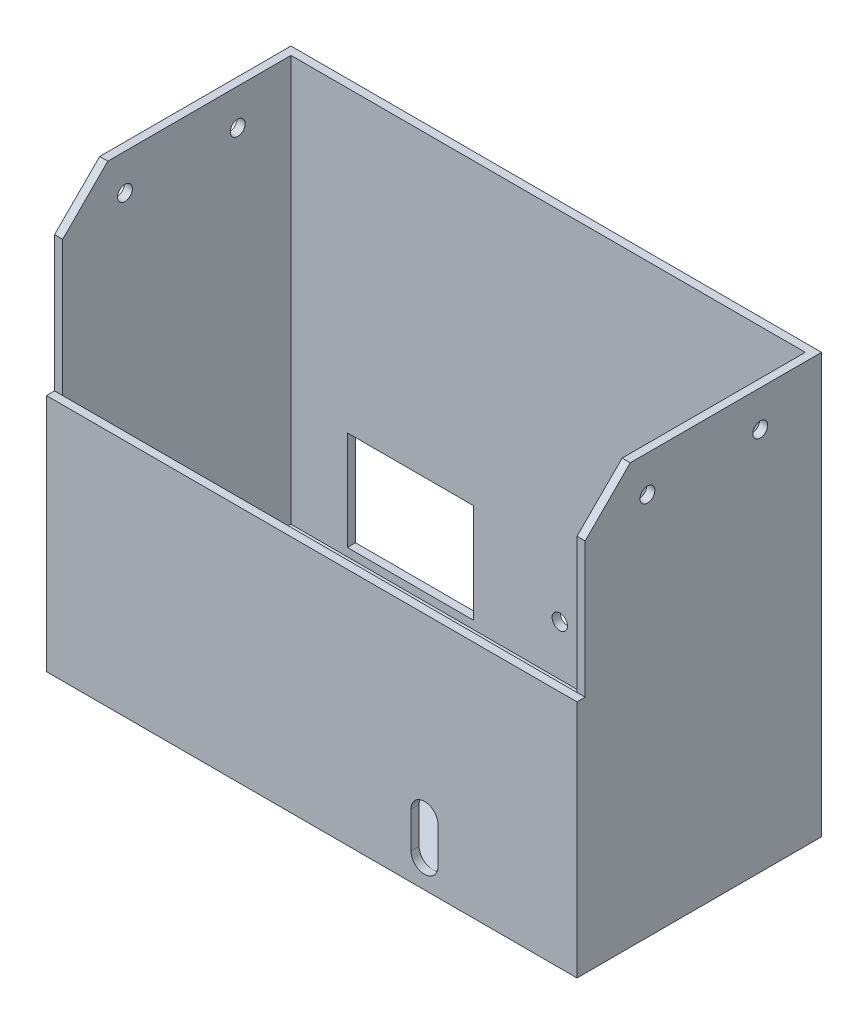
ISO-10303-21;
HEADER;
FILE_DESCRIPTION(('STEP AP214'),'2;1');
FILE_NAME('part.step','',(''),(''),'','','');
FILE_SCHEMA(('AUTOMOTIVE_DESIGN { 1 0 10303 214 1 1 1 1 }'));
ENDSEC;
DATA;
#1=APPLICATION_CONTEXT('core data for automotive mechanical design processes');
#2=APPLICATION_PROTOCOL_DEFINITION('international standard','automotive_design',2000,#1);
#3=PRODUCT_CONTEXT('',#1,'mechanical');
#4=PRODUCT('Part','Part','',(#3));
#5=PRODUCT_RELATED_PRODUCT_CATEGORY('part','',(#4));
#6=PRODUCT_DEFINITION_FORMATION('','',#4);
#7=PRODUCT_DEFINITION_CONTEXT('part definition',#1,'design');
#8=PRODUCT_DEFINITION('design','',#6,#7);
#9=PRODUCT_DEFINITION_SHAPE('','',#8);
#10=(LENGTH_UNIT() NAMED_UNIT(*) SI_UNIT(.MILLI.,.METRE.));
#11=(NAMED_UNIT(*) PLANE_ANGLE_UNIT() SI_UNIT($,.RADIAN.));
#12=(NAMED_UNIT(*) SI_UNIT($,.STERADIAN.) SOLID_ANGLE_UNIT());
#13=UNCERTAINTY_MEASURE_WITH_UNIT(LENGTH_MEASURE(1.E-05),#10,'distance_accuracy_value','');
#14=(GEOMETRIC_REPRESENTATION_CONTEXT(3) GLOBAL_UNCERTAINTY_ASSIGNED_CONTEXT((#13)) GLOBAL_UNIT_ASSIGNED_CONTEXT((#10,
#11,#12)) REPRESENTATION_CONTEXT('',''));
#15=CARTESIAN_POINT('',(0.,0.,0.));
#16=DIRECTION('',(0.,0.,1.));
#17=DIRECTION('',(1.,0.,0.));
#18=AXIS2_PLACEMENT_3D('',#15,#16,#17);
#19=CARTESIAN_POINT('',(-58.8,3.,-27.1));
#20=DIRECTION('',(1.,0.,0.));
#21=DIRECTION('',(0.,0.,-1.));
#22=AXIS2_PLACEMENT_3D('',#19,#20,#21);
#23=PLANE('',#22);
#24=CARTESIAN_POINT('',(-58.8,85.,11.5));
#25=DIRECTION('',(-1.,0.,0.));
#26=DIRECTION('',(0.,0.,1.));
#27=AXIS2_PLACEMENT_3D('',#24,#25,#26);
#28=CIRCLE('',#27,1.65);
#29=CARTESIAN_POINT('',(-58.8,85.,13.15));
#30=VERTEX_POINT('',#29);
#31=EDGE_CURVE('E335',#30,#30,#28,.T.);
#32=ORIENTED_EDGE('',*,*,#31,.F.);
#33=EDGE_LOOP('',(#32));
#34=FACE_BOUND('',#33,.T.);
#35=CARTESIAN_POINT('',(-58.8,85.,-13.5));
#36=DIRECTION('',(-1.,0.,0.));
#37=DIRECTION('',(0.,0.,1.));
#38=AXIS2_PLACEMENT_3D('',#35,#36,#37);
#39=CIRCLE('',#38,1.65);
#40=CARTESIAN_POINT('',(-58.8,85.,-11.85));
#41=VERTEX_POINT('',#40);
#42=EDGE_CURVE('E307',#41,#41,#39,.T.);
#43=ORIENTED_EDGE('',*,*,#42,.F.);
#44=EDGE_LOOP('',(#43));
#45=FACE_BOUND('',#44,.T.);
#46=DIRECTION('',(0.,-1.,0.));
#47=VECTOR('',#46,1.);
#48=CARTESIAN_POINT('',(-58.8,93.,25.3));
#49=LINE('',#48,#47);
#50=CARTESIAN_POINT('',(-58.8,83.,25.3));
#51=VERTEX_POINT('',#50);
#52=CARTESIAN_POINT('',(-58.8,53.,25.3));
#53=VERTEX_POINT('',#52);
#54=EDGE_CURVE('E377',#51,#53,#49,.T.);
#55=ORIENTED_EDGE('',*,*,#54,.F.);
#56=DIRECTION('',(0.,0.707106781186549,-0.707106781186547));
#57=VECTOR('',#56,1.);
#58=CARTESIAN_POINT('',(-58.8,92.9999999999999,15.3000000000001));
#59=LINE('',#58,#57);
#60=CARTESIAN_POINT('',(-58.8,93.,15.3));
#61=VERTEX_POINT('',#60);
#62=EDGE_CURVE('E11',#51,#61,#59,.T.);
#63=ORIENTED_EDGE('',*,*,#62,.T.);
#64=DIRECTION('',(0.,0.,1.));
#65=VECTOR('',#64,1.);
#66=CARTESIAN_POINT('',(-58.8,93.,-27.1));
#67=LINE('',#66,#65);
#68=CARTESIAN_POINT('',(-58.8,93.,-27.1));
#69=VERTEX_POINT('',#68);
#70=EDGE_CURVE('E356',#69,#61,#67,.T.);
#71=ORIENTED_EDGE('',*,*,#70,.F.);
#72=DIRECTION('',(0.,-1.,0.));
#73=VECTOR('',#72,1.);
#74=CARTESIAN_POINT('',(-58.8,3.,-27.1));
#75=LINE('',#74,#73);
#76=CARTESIAN_POINT('',(-58.8,0.,-27.1));
#77=VERTEX_POINT('',#76);
#78=EDGE_CURVE('E418',#69,#77,#75,.T.);
#79=ORIENTED_EDGE('',*,*,#78,.T.);
#80=DIRECTION('',(0.,0.,1.));
#81=VECTOR('',#80,1.);
#82=CARTESIAN_POINT('',(-58.8,0.,-27.1));
#83=LINE('',#82,#81);
#84=CARTESIAN_POINT('',(-58.8,0.,27.1));
#85=VERTEX_POINT('',#84);
#86=EDGE_CURVE('E409',#77,#85,#83,.T.);
#87=ORIENTED_EDGE('',*,*,#86,.T.);
#88=DIRECTION('',(0.,-1.,0.));
#89=VECTOR('',#88,1.);
#90=CARTESIAN_POINT('',(-58.8,3.,27.1));
#91=LINE('',#90,#89);
#92=CARTESIAN_POINT('',(-58.8,53.,27.1));
#93=VERTEX_POINT('',#92);
#94=EDGE_CURVE('E427',#93,#85,#91,.T.);
#95=ORIENTED_EDGE('',*,*,#94,.F.);
#96=DIRECTION('',(0.,0.,1.));
#97=VECTOR('',#96,1.);
#98=CARTESIAN_POINT('',(-58.8,53.,-27.1));
#99=LINE('',#98,#97);
#100=EDGE_CURVE('E401',#53,#93,#99,.T.);
#101=ORIENTED_EDGE('',*,*,#100,.F.);
#102=EDGE_LOOP('',(#55,#63,#71,#79,#87,#95,#101));
#103=FACE_BOUND('',#102,.T.);
#104=ADVANCED_FACE('F41',(#34,#45,#103),#23,.F.);
#105=CARTESIAN_POINT('',(-58.8,3.,27.1));
#106=DIRECTION('',(0.,0.,-1.));
#107=DIRECTION('',(-1.,0.,0.));
#108=AXIS2_PLACEMENT_3D('',#105,#106,#107);
#109=PLANE('',#108);
#110=CARTESIAN_POINT('',(25.,14.,27.1));
#111=DIRECTION('',(0.,0.,1.));
#112=DIRECTION('',(1.,0.,0.));
#113=AXIS2_PLACEMENT_3D('',#110,#111,#112);
#114=CIRCLE('',#113,3.);
#115=CARTESIAN_POINT('',(28.,14.,27.1));
#116=VERTEX_POINT('',#115);
#117=CARTESIAN_POINT('',(22.,14.,27.1));
#118=VERTEX_POINT('',#117);
#119=EDGE_CURVE('E247',#116,#118,#114,.T.);
#120=ORIENTED_EDGE('',*,*,#119,.F.);
#121=DIRECTION('',(0.,1.,0.));
#122=VECTOR('',#121,1.);
#123=CARTESIAN_POINT('',(28.,6.,27.1));
#124=LINE('',#123,#122);
#125=CARTESIAN_POINT('',(28.,6.,27.1));
#126=VERTEX_POINT('',#125);
#127=EDGE_CURVE('E245',#126,#116,#124,.T.);
#128=ORIENTED_EDGE('',*,*,#127,.F.);
#129=CARTESIAN_POINT('',(25.,6.,27.1));
#130=DIRECTION('',(0.,0.,1.));
#131=DIRECTION('',(1.,0.,0.));
#132=AXIS2_PLACEMENT_3D('',#129,#130,#131);
#133=CIRCLE('',#132,3.);
#134=CARTESIAN_POINT('',(22.,6.,27.1));
#135=VERTEX_POINT('',#134);
#136=EDGE_CURVE('E228',#135,#126,#133,.T.);
#137=ORIENTED_EDGE('',*,*,#136,.F.);
#138=DIRECTION('',(0.,-1.,0.));
#139=VECTOR('',#138,1.);
#140=CARTESIAN_POINT('',(22.,6.,27.1));
#141=LINE('',#140,#139);
#142=EDGE_CURVE('E59',#118,#135,#141,.T.);
#143=ORIENTED_EDGE('',*,*,#142,.F.);
#144=EDGE_LOOP('',(#120,#128,#137,#143));
#145=FACE_BOUND('',#144,.T.);
#146=DIRECTION('',(1.,0.,0.));
#147=VECTOR('',#146,1.);
#148=CARTESIAN_POINT('',(-58.8,0.,27.1));
#149=LINE('',#148,#147);
#150=CARTESIAN_POINT('',(58.8,0.,27.1));
#151=VERTEX_POINT('',#150);
#152=EDGE_CURVE('E412',#85,#151,#149,.T.);
#153=ORIENTED_EDGE('',*,*,#152,.T.);
#154=DIRECTION('',(0.,-1.,0.));
#155=VECTOR('',#154,1.);
#156=CARTESIAN_POINT('',(58.8,3.,27.1));
#157=LINE('',#156,#155);
#158=CARTESIAN_POINT('',(58.8,53.,27.1));
#159=VERTEX_POINT('',#158);
#160=EDGE_CURVE('E424',#159,#151,#157,.T.);
#161=ORIENTED_EDGE('',*,*,#160,.F.);
#162=DIRECTION('',(1.,0.,0.));
#163=VECTOR('',#162,1.);
#164=CARTESIAN_POINT('',(-58.8,53.,27.1));
#165=LINE('',#164,#163);
#166=EDGE_CURVE('E403',#93,#159,#165,.T.);
#167=ORIENTED_EDGE('',*,*,#166,.F.);
#168=ORIENTED_EDGE('',*,*,#94,.T.);
#169=EDGE_LOOP('',(#153,#161,#167,#168));
#170=FACE_BOUND('',#169,.T.);
#171=ADVANCED_FACE('F512',(#145,#170),#109,.F.);
#172=CARTESIAN_POINT('',(58.8,3.,27.1));
#173=DIRECTION('',(-1.,0.,0.));
#174=DIRECTION('',(0.,0.,1.));
#175=AXIS2_PLACEMENT_3D('',#172,#173,#174);
#176=PLANE('',#175);
#177=CARTESIAN_POINT('',(58.8,85.,11.5));
#178=DIRECTION('',(-1.,0.,0.));
#179=DIRECTION('',(0.,0.,1.));
#180=AXIS2_PLACEMENT_3D('',#177,#178,#179);
#181=CIRCLE('',#180,1.65);
#182=CARTESIAN_POINT('',(58.8,85.,13.15));
#183=VERTEX_POINT('',#182);
#184=EDGE_CURVE('E331',#183,#183,#181,.T.);
#185=ORIENTED_EDGE('',*,*,#184,.T.);
#186=EDGE_LOOP('',(#185));
#187=FACE_BOUND('',#186,.T.);
#188=CARTESIAN_POINT('',(58.8,85.,-13.5));
#189=DIRECTION('',(-1.,0.,0.));
#190=DIRECTION('',(0.,0.,1.));
#191=AXIS2_PLACEMENT_3D('',#188,#189,#190);
#192=CIRCLE('',#191,1.65);
#193=CARTESIAN_POINT('',(58.8,85.,-11.85));
#194=VERTEX_POINT('',#193);
#195=EDGE_CURVE('E338',#194,#194,#192,.T.);
#196=ORIENTED_EDGE('',*,*,#195,.T.);
#197=EDGE_LOOP('',(#196));
#198=FACE_BOUND('',#197,.T.);
#199=DIRECTION('',(0.,0.,-1.));
#200=VECTOR('',#199,1.);
#201=CARTESIAN_POINT('',(58.8,93.,25.3));
#202=LINE('',#201,#200);
#203=CARTESIAN_POINT('',(58.8,93.,15.3));
#204=VERTEX_POINT('',#203);
#205=CARTESIAN_POINT('',(58.8,93.,-27.1));
#206=VERTEX_POINT('',#205);
#207=EDGE_CURVE('E350',#204,#206,#202,.T.);
#208=ORIENTED_EDGE('',*,*,#207,.F.);
#209=DIRECTION('',(0.,-0.707106781186549,0.707106781186547));
#210=VECTOR('',#209,1.);
#211=CARTESIAN_POINT('',(58.8,93.,15.3));
#212=LINE('',#211,#210);
#213=CARTESIAN_POINT('',(58.8,83.,25.3));
#214=VERTEX_POINT('',#213);
#215=EDGE_CURVE('E436',#204,#214,#212,.T.);
#216=ORIENTED_EDGE('',*,*,#215,.T.);
#217=DIRECTION('',(0.,-1.,0.));
#218=VECTOR('',#217,1.);
#219=CARTESIAN_POINT('',(58.8,93.,25.3));
#220=LINE('',#219,#218);
#221=CARTESIAN_POINT('',(58.8,53.,25.3));
#222=VERTEX_POINT('',#221);
#223=EDGE_CURVE('E367',#214,#222,#220,.T.);
#224=ORIENTED_EDGE('',*,*,#223,.T.);
#225=DIRECTION('',(0.,0.,-1.));
#226=VECTOR('',#225,1.);
#227=CARTESIAN_POINT('',(58.8,53.,27.1));
#228=LINE('',#227,#226);
#229=EDGE_CURVE('E406',#159,#222,#228,.T.);
#230=ORIENTED_EDGE('',*,*,#229,.F.);
#231=ORIENTED_EDGE('',*,*,#160,.T.);
#232=DIRECTION('',(0.,0.,-1.));
#233=VECTOR('',#232,1.);
#234=CARTESIAN_POINT('',(58.8,0.,27.1));
#235=LINE('',#234,#233);
#236=CARTESIAN_POINT('',(58.8,0.,-27.1));
#237=VERTEX_POINT('',#236);
#238=EDGE_CURVE('E414',#151,#237,#235,.T.);
#239=ORIENTED_EDGE('',*,*,#238,.T.);
#240=DIRECTION('',(0.,-1.,0.));
#241=VECTOR('',#240,1.);
#242=CARTESIAN_POINT('',(58.8,3.,-27.1));
#243=LINE('',#242,#241);
#244=EDGE_CURVE('E421',#206,#237,#243,.T.);
#245=ORIENTED_EDGE('',*,*,#244,.F.);
#246=EDGE_LOOP('',(#208,#216,#224,#230,#231,#239,#245));
#247=FACE_BOUND('',#246,.T.);
#248=ADVANCED_FACE('F472',(#187,#198,#247),#176,.F.);
#249=CARTESIAN_POINT('',(58.8,3.,-27.1));
#250=DIRECTION('',(0.,0.,1.));
#251=DIRECTION('',(1.,0.,0.));
#252=AXIS2_PLACEMENT_3D('',#249,#250,#251);
#253=PLANE('',#252);
#254=DIRECTION('',(1.,0.,0.));
#255=VECTOR('',#254,1.);
#256=CARTESIAN_POINT('',(-16.5,26.8,-27.1));
#257=LINE('',#256,#255);
#258=CARTESIAN_POINT('',(-44.5,26.8,-27.1));
#259=VERTEX_POINT('',#258);
#260=CARTESIAN_POINT('',(-16.5,26.8,-27.1));
#261=VERTEX_POINT('',#260);
#262=EDGE_CURVE('E273',#259,#261,#257,.T.);
#263=ORIENTED_EDGE('',*,*,#262,.F.);
#264=DIRECTION('',(0.,1.,0.));
#265=VECTOR('',#264,1.);
#266=CARTESIAN_POINT('',(-44.5,26.8,-27.1));
#267=LINE('',#266,#265);
#268=CARTESIAN_POINT('',(-44.5,4.8,-27.1));
#269=VERTEX_POINT('',#268);
#270=EDGE_CURVE('E276',#269,#259,#267,.T.);
#271=ORIENTED_EDGE('',*,*,#270,.F.);
#272=DIRECTION('',(-1.,0.,0.));
#273=VECTOR('',#272,1.);
#274=CARTESIAN_POINT('',(-16.5,4.8,-27.1));
#275=LINE('',#274,#273);
#276=CARTESIAN_POINT('',(-16.5,4.8,-27.1));
#277=VERTEX_POINT('',#276);
#278=EDGE_CURVE('E266',#277,#269,#275,.T.);
#279=ORIENTED_EDGE('',*,*,#278,.F.);
#280=DIRECTION('',(0.,-1.,0.));
#281=VECTOR('',#280,1.);
#282=CARTESIAN_POINT('',(-16.5,26.8,-27.1));
#283=LINE('',#282,#281);
#284=EDGE_CURVE('E270',#261,#277,#283,.T.);
#285=ORIENTED_EDGE('',*,*,#284,.F.);
#286=EDGE_LOOP('',(#263,#271,#279,#285));
#287=FACE_BOUND('',#286,.T.);
#288=CARTESIAN_POINT('',(44.275,14.075,-27.1));
#289=DIRECTION('',(0.,0.,-1.));
#290=DIRECTION('',(-1.,0.,0.));
#291=AXIS2_PLACEMENT_3D('',#288,#289,#290);
#292=CIRCLE('',#291,1.7);
#293=CARTESIAN_POINT('',(42.575,14.075,-27.1));
#294=VERTEX_POINT('',#293);
#295=EDGE_CURVE('E282',#294,#294,#292,.T.);
#296=ORIENTED_EDGE('',*,*,#295,.F.);
#297=EDGE_LOOP('',(#296));
#298=FACE_BOUND('',#297,.T.);
#299=CARTESIAN_POINT('',(2.57500000000001,14.075,-27.1));
#300=DIRECTION('',(0.,0.,-1.));
#301=DIRECTION('',(-1.,0.,0.));
#302=AXIS2_PLACEMENT_3D('',#299,#300,#301);
#303=CIRCLE('',#302,1.7);
#304=CARTESIAN_POINT('',(0.875000000000014,14.075,-27.1));
#305=VERTEX_POINT('',#304);
#306=EDGE_CURVE('E257',#305,#305,#303,.T.);
#307=ORIENTED_EDGE('',*,*,#306,.F.);
#308=EDGE_LOOP('',(#307));
#309=FACE_BOUND('',#308,.T.);
#310=DIRECTION('',(1.,0.,0.));
#311=VECTOR('',#310,1.);
#312=CARTESIAN_POINT('',(39.4,23.8,-27.1));
#313=LINE('',#312,#311);
#314=CARTESIAN_POINT('',(11.4,23.8,-27.1));
#315=VERTEX_POINT('',#314);
#316=CARTESIAN_POINT('',(39.4,23.8,-27.1));
#317=VERTEX_POINT('',#316);
#318=EDGE_CURVE('E311',#315,#317,#313,.T.);
#319=ORIENTED_EDGE('',*,*,#318,.F.);
#320=DIRECTION('',(0.,1.,0.));
#321=VECTOR('',#320,1.);
#322=CARTESIAN_POINT('',(11.4,23.8,-27.1));
#323=LINE('',#322,#321);
#324=CARTESIAN_POINT('',(11.4,4.2,-27.1));
#325=VERTEX_POINT('',#324);
#326=EDGE_CURVE('E314',#325,#315,#323,.T.);
#327=ORIENTED_EDGE('',*,*,#326,.F.);
#328=DIRECTION('',(-1.,0.,0.));
#329=VECTOR('',#328,1.);
#330=CARTESIAN_POINT('',(39.4,4.2,-27.1));
#331=LINE('',#330,#329);
#332=CARTESIAN_POINT('',(39.4,4.2,-27.1));
#333=VERTEX_POINT('',#332);
#334=EDGE_CURVE('E304',#333,#325,#331,.T.);
#335=ORIENTED_EDGE('',*,*,#334,.F.);
#336=DIRECTION('',(0.,-1.,0.));
#337=VECTOR('',#336,1.);
#338=CARTESIAN_POINT('',(39.4,23.8,-27.1));
#339=LINE('',#338,#337);
#340=EDGE_CURVE('E308',#317,#333,#339,.T.);
#341=ORIENTED_EDGE('',*,*,#340,.F.);
#342=EDGE_LOOP('',(#319,#327,#335,#341));
#343=FACE_BOUND('',#342,.T.);
#344=DIRECTION('',(-1.,0.,0.));
#345=VECTOR('',#344,1.);
#346=CARTESIAN_POINT('',(58.8,0.,-27.1));
#347=LINE('',#346,#345);
#348=EDGE_CURVE('E416',#237,#77,#347,.T.);
#349=ORIENTED_EDGE('',*,*,#348,.T.);
#350=ORIENTED_EDGE('',*,*,#78,.F.);
#351=DIRECTION('',(-1.,0.,0.));
#352=VECTOR('',#351,1.);
#353=CARTESIAN_POINT('',(58.8,93.,-27.1));
#354=LINE('',#353,#352);
#355=EDGE_CURVE('E352',#206,#69,#354,.T.);
#356=ORIENTED_EDGE('',*,*,#355,.F.);
#357=ORIENTED_EDGE('',*,*,#244,.T.);
#358=EDGE_LOOP('',(#349,#350,#356,#357));
#359=FACE_BOUND('',#358,.T.);
#360=ADVANCED_FACE('F478',(#287,#298,#309,#343,#359),#253,.F.);
#361=CARTESIAN_POINT('',(0.,0.,0.));
#362=DIRECTION('',(0.,1.,0.));
#363=DIRECTION('',(0.,0.,1.));
#364=AXIS2_PLACEMENT_3D('',#361,#362,#363);
#365=PLANE('',#364);
#366=ORIENTED_EDGE('',*,*,#86,.F.);
#367=ORIENTED_EDGE('',*,*,#348,.F.);
#368=ORIENTED_EDGE('',*,*,#238,.F.);
#369=ORIENTED_EDGE('',*,*,#152,.F.);
#370=EDGE_LOOP('',(#366,#367,#368,#369));
#371=FACE_BOUND('',#370,.T.);
#372=ADVANCED_FACE('F510',(#371),#365,.F.);
#373=CARTESIAN_POINT('',(0.,53.,0.));
#374=DIRECTION('',(0.,1.,0.));
#375=DIRECTION('',(0.,0.,1.));
#376=AXIS2_PLACEMENT_3D('',#373,#374,#375);
#377=PLANE('',#376);
#378=DIRECTION('',(1.,0.,0.));
#379=VECTOR('',#378,1.);
#380=CARTESIAN_POINT('',(57.,53.,25.3));
#381=LINE('',#380,#379);
#382=CARTESIAN_POINT('',(57.,53.,25.3));
#383=VERTEX_POINT('',#382);
#384=EDGE_CURVE('E353',#383,#222,#381,.T.);
#385=ORIENTED_EDGE('',*,*,#384,.F.);
#386=DIRECTION('',(1.,0.,0.));
#387=VECTOR('',#386,1.);
#388=CARTESIAN_POINT('',(-57.,53.,25.3));
#389=LINE('',#388,#387);
#390=CARTESIAN_POINT('',(-57.,53.,25.3));
#391=VERTEX_POINT('',#390);
#392=EDGE_CURVE('E380',#391,#383,#389,.T.);
#393=ORIENTED_EDGE('',*,*,#392,.F.);
#394=DIRECTION('',(1.,0.,0.));
#395=VECTOR('',#394,1.);
#396=CARTESIAN_POINT('',(-57.,53.,25.3));
#397=LINE('',#396,#395);
#398=EDGE_CURVE('E349',#53,#391,#397,.T.);
#399=ORIENTED_EDGE('',*,*,#398,.F.);
#400=ORIENTED_EDGE('',*,*,#100,.T.);
#401=ORIENTED_EDGE('',*,*,#166,.T.);
#402=ORIENTED_EDGE('',*,*,#229,.T.);
#403=EDGE_LOOP('',(#385,#393,#399,#400,#401,#402));
#404=FACE_BOUND('',#403,.T.);
#405=ADVANCED_FACE('F504',(#404),#377,.T.);
#406=CARTESIAN_POINT('',(57.,53.,-25.3));
#407=DIRECTION('',(0.,0.,1.));
#408=DIRECTION('',(1.,0.,0.));
#409=AXIS2_PLACEMENT_3D('',#406,#407,#408);
#410=PLANE('',#409);
#411=DIRECTION('',(0.,1.,0.));
#412=VECTOR('',#411,1.);
#413=CARTESIAN_POINT('',(-44.5,26.8,-25.3));
#414=LINE('',#413,#412);
#415=CARTESIAN_POINT('',(-44.5,4.8,-25.3));
#416=VERTEX_POINT('',#415);
#417=CARTESIAN_POINT('',(-44.5,26.8,-25.3));
#418=VERTEX_POINT('',#417);
#419=EDGE_CURVE('E278',#416,#418,#414,.T.);
#420=ORIENTED_EDGE('',*,*,#419,.T.);
#421=DIRECTION('',(1.,0.,0.));
#422=VECTOR('',#421,1.);
#423=CARTESIAN_POINT('',(-16.5,26.8,-25.3));
#424=LINE('',#423,#422);
#425=CARTESIAN_POINT('',(-16.5,26.8,-25.3));
#426=VERTEX_POINT('',#425);
#427=EDGE_CURVE('E261',#418,#426,#424,.T.);
#428=ORIENTED_EDGE('',*,*,#427,.T.);
#429=DIRECTION('',(0.,-1.,0.));
#430=VECTOR('',#429,1.);
#431=CARTESIAN_POINT('',(-16.5,26.8,-25.3));
#432=LINE('',#431,#430);
#433=CARTESIAN_POINT('',(-16.5,4.8,-25.3));
#434=VERTEX_POINT('',#433);
#435=EDGE_CURVE('E287',#426,#434,#432,.T.);
#436=ORIENTED_EDGE('',*,*,#435,.T.);
#437=DIRECTION('',(-1.,0.,0.));
#438=VECTOR('',#437,1.);
#439=CARTESIAN_POINT('',(-16.5,4.8,-25.3));
#440=LINE('',#439,#438);
#441=EDGE_CURVE('E283',#434,#416,#440,.T.);
#442=ORIENTED_EDGE('',*,*,#441,.T.);
#443=EDGE_LOOP('',(#420,#428,#436,#442));
#444=FACE_BOUND('',#443,.T.);
#445=CARTESIAN_POINT('',(44.275,14.075,-25.3));
#446=DIRECTION('',(0.,0.,1.));
#447=DIRECTION('',(1.,0.,0.));
#448=AXIS2_PLACEMENT_3D('',#445,#446,#447);
#449=CIRCLE('',#448,1.7);
#450=CARTESIAN_POINT('',(45.975,14.075,-25.3));
#451=VERTEX_POINT('',#450);
#452=EDGE_CURVE('E260',#451,#451,#449,.F.);
#453=ORIENTED_EDGE('',*,*,#452,.T.);
#454=EDGE_LOOP('',(#453));
#455=FACE_BOUND('',#454,.T.);
#456=CARTESIAN_POINT('',(2.57500000000001,14.075,-25.3));
#457=DIRECTION('',(0.,0.,1.));
#458=DIRECTION('',(1.,0.,0.));
#459=AXIS2_PLACEMENT_3D('',#456,#457,#458);
#460=CIRCLE('',#459,1.7);
#461=CARTESIAN_POINT('',(4.27500000000002,14.075,-25.3));
#462=VERTEX_POINT('',#461);
#463=EDGE_CURVE('E223',#462,#462,#460,.F.);
#464=ORIENTED_EDGE('',*,*,#463,.T.);
#465=EDGE_LOOP('',(#464));
#466=FACE_BOUND('',#465,.T.);
#467=DIRECTION('',(0.,1.,0.));
#468=VECTOR('',#467,1.);
#469=CARTESIAN_POINT('',(11.4,23.8,-25.3));
#470=LINE('',#469,#468);
#471=CARTESIAN_POINT('',(11.4,4.2,-25.3));
#472=VERTEX_POINT('',#471);
#473=CARTESIAN_POINT('',(11.4,23.8,-25.3));
#474=VERTEX_POINT('',#473);
#475=EDGE_CURVE('E269',#472,#474,#470,.T.);
#476=ORIENTED_EDGE('',*,*,#475,.T.);
#477=DIRECTION('',(1.,0.,0.));
#478=VECTOR('',#477,1.);
#479=CARTESIAN_POINT('',(39.4,23.8,-25.3));
#480=LINE('',#479,#478);
#481=CARTESIAN_POINT('',(39.4,23.8,-25.3));
#482=VERTEX_POINT('',#481);
#483=EDGE_CURVE('E299',#474,#482,#480,.T.);
#484=ORIENTED_EDGE('',*,*,#483,.T.);
#485=DIRECTION('',(0.,-1.,0.));
#486=VECTOR('',#485,1.);
#487=CARTESIAN_POINT('',(39.4,23.8,-25.3));
#488=LINE('',#487,#486);
#489=CARTESIAN_POINT('',(39.4,4.2,-25.3));
#490=VERTEX_POINT('',#489);
#491=EDGE_CURVE('E323',#482,#490,#488,.T.);
#492=ORIENTED_EDGE('',*,*,#491,.T.);
#493=DIRECTION('',(-1.,0.,0.));
#494=VECTOR('',#493,1.);
#495=CARTESIAN_POINT('',(39.4,4.2,-25.3));
#496=LINE('',#495,#494);
#497=EDGE_CURVE('E319',#490,#472,#496,.T.);
#498=ORIENTED_EDGE('',*,*,#497,.T.);
#499=EDGE_LOOP('',(#476,#484,#492,#498));
#500=FACE_BOUND('',#499,.T.);
#501=DIRECTION('',(-1.,0.,0.));
#502=VECTOR('',#501,1.);
#503=CARTESIAN_POINT('',(57.,3.,-25.3));
#504=LINE('',#503,#502);
#505=CARTESIAN_POINT('',(57.,3.,-25.3));
#506=VERTEX_POINT('',#505);
#507=CARTESIAN_POINT('',(-57.,3.,-25.3));
#508=VERTEX_POINT('',#507);
#509=EDGE_CURVE('E379',#506,#508,#504,.T.);
#510=ORIENTED_EDGE('',*,*,#509,.F.);
#511=DIRECTION('',(0.,-1.,0.));
#512=VECTOR('',#511,1.);
#513=CARTESIAN_POINT('',(57.,53.,-25.3));
#514=LINE('',#513,#512);
#515=CARTESIAN_POINT('',(57.,93.,-25.3));
#516=VERTEX_POINT('',#515);
#517=EDGE_CURVE('E383',#516,#506,#514,.T.);
#518=ORIENTED_EDGE('',*,*,#517,.F.);
#519=DIRECTION('',(1.,0.,0.));
#520=VECTOR('',#519,1.);
#521=CARTESIAN_POINT('',(57.,93.,-25.3));
#522=LINE('',#521,#520);
#523=CARTESIAN_POINT('',(-57.,93.,-25.3));
#524=VERTEX_POINT('',#523);
#525=EDGE_CURVE('E361',#524,#516,#522,.T.);
#526=ORIENTED_EDGE('',*,*,#525,.F.);
#527=DIRECTION('',(0.,-1.,0.));
#528=VECTOR('',#527,1.);
#529=CARTESIAN_POINT('',(-57.,53.,-25.3));
#530=LINE('',#529,#528);
#531=EDGE_CURVE('E398',#524,#508,#530,.T.);
#532=ORIENTED_EDGE('',*,*,#531,.T.);
#533=EDGE_LOOP('',(#510,#518,#526,#532));
#534=FACE_BOUND('',#533,.T.);
#535=ADVANCED_FACE('F497',(#444,#455,#466,#500,#534),#410,.T.);
#536=CARTESIAN_POINT('',(-57.,53.,-25.3));
#537=DIRECTION('',(1.,0.,0.));
#538=DIRECTION('',(0.,0.,-1.));
#539=AXIS2_PLACEMENT_3D('',#536,#537,#538);
#540=PLANE('',#539);
#541=CARTESIAN_POINT('',(-57.,85.,11.5));
#542=DIRECTION('',(1.,0.,0.));
#543=DIRECTION('',(0.,0.,-1.));
#544=AXIS2_PLACEMENT_3D('',#541,#542,#543);
#545=CIRCLE('',#544,1.65);
#546=CARTESIAN_POINT('',(-57.,85.,9.85));
#547=VERTEX_POINT('',#546);
#548=EDGE_CURVE('E346',#547,#547,#545,.T.);
#549=ORIENTED_EDGE('',*,*,#548,.F.);
#550=EDGE_LOOP('',(#549));
#551=FACE_BOUND('',#550,.T.);
#552=CARTESIAN_POINT('',(-57.,85.,-13.5));
#553=DIRECTION('',(1.,0.,0.));
#554=DIRECTION('',(0.,0.,-1.));
#555=AXIS2_PLACEMENT_3D('',#552,#553,#554);
#556=CIRCLE('',#555,1.65);
#557=CARTESIAN_POINT('',(-57.,85.,-15.15));
#558=VERTEX_POINT('',#557);
#559=EDGE_CURVE('E343',#558,#558,#556,.T.);
#560=ORIENTED_EDGE('',*,*,#559,.F.);
#561=EDGE_LOOP('',(#560));
#562=FACE_BOUND('',#561,.T.);
#563=DIRECTION('',(0.,0.,-1.));
#564=VECTOR('',#563,1.);
#565=CARTESIAN_POINT('',(-57.,93.,-25.3));
#566=LINE('',#565,#564);
#567=CARTESIAN_POINT('',(-57.,93.,15.3));
#568=VERTEX_POINT('',#567);
#569=EDGE_CURVE('E359',#568,#524,#566,.T.);
#570=ORIENTED_EDGE('',*,*,#569,.F.);
#571=DIRECTION('',(0.,-0.707106781186548,0.707106781186546));
#572=VECTOR('',#571,1.);
#573=CARTESIAN_POINT('',(-57.,93.3,15.0000000000001));
#574=LINE('',#573,#572);
#575=CARTESIAN_POINT('',(-57.,83.,25.3));
#576=VERTEX_POINT('',#575);
#577=EDGE_CURVE('E442',#568,#576,#574,.T.);
#578=ORIENTED_EDGE('',*,*,#577,.T.);
#579=DIRECTION('',(0.,-1.,0.));
#580=VECTOR('',#579,1.);
#581=CARTESIAN_POINT('',(-57.,93.,25.3));
#582=LINE('',#581,#580);
#583=EDGE_CURVE('E375',#576,#391,#582,.T.);
#584=ORIENTED_EDGE('',*,*,#583,.T.);
#585=DIRECTION('',(0.,-1.,0.));
#586=VECTOR('',#585,1.);
#587=CARTESIAN_POINT('',(-57.,53.,25.3));
#588=LINE('',#587,#586);
#589=CARTESIAN_POINT('',(-57.,3.,25.3));
#590=VERTEX_POINT('',#589);
#591=EDGE_CURVE('E395',#391,#590,#588,.T.);
#592=ORIENTED_EDGE('',*,*,#591,.T.);
#593=DIRECTION('',(0.,0.,1.));
#594=VECTOR('',#593,1.);
#595=CARTESIAN_POINT('',(-57.,3.,-25.3));
#596=LINE('',#595,#594);
#597=EDGE_CURVE('E386',#508,#590,#596,.T.);
#598=ORIENTED_EDGE('',*,*,#597,.F.);
#599=ORIENTED_EDGE('',*,*,#531,.F.);
#600=EDGE_LOOP('',(#570,#578,#584,#592,#598,#599));
#601=FACE_BOUND('',#600,.T.);
#602=ADVANCED_FACE('F491',(#551,#562,#601),#540,.T.);
#603=CARTESIAN_POINT('',(-57.,53.,25.3));
#604=DIRECTION('',(0.,0.,-1.));
#605=DIRECTION('',(-1.,0.,0.));
#606=AXIS2_PLACEMENT_3D('',#603,#604,#605);
#607=PLANE('',#606);
#608=DIRECTION('',(0.,1.,0.));
#609=VECTOR('',#608,1.);
#610=CARTESIAN_POINT('',(28.,6.,25.3));
#611=LINE('',#610,#609);
#612=CARTESIAN_POINT('',(28.,6.,25.3));
#613=VERTEX_POINT('',#612);
#614=CARTESIAN_POINT('',(28.,14.,25.3));
#615=VERTEX_POINT('',#614);
#616=EDGE_CURVE('E215',#613,#615,#611,.T.);
#617=ORIENTED_EDGE('',*,*,#616,.T.);
#618=CARTESIAN_POINT('',(25.,14.,25.3));
#619=DIRECTION('',(0.,0.,-1.));
#620=DIRECTION('',(-1.,0.,0.));
#621=AXIS2_PLACEMENT_3D('',#618,#619,#620);
#622=CIRCLE('',#621,3.);
#623=CARTESIAN_POINT('',(22.,14.,25.3));
#624=VERTEX_POINT('',#623);
#625=EDGE_CURVE('E240',#615,#624,#622,.F.);
#626=ORIENTED_EDGE('',*,*,#625,.T.);
#627=DIRECTION('',(0.,-1.,0.));
#628=VECTOR('',#627,1.);
#629=CARTESIAN_POINT('',(22.,6.,25.3));
#630=LINE('',#629,#628);
#631=CARTESIAN_POINT('',(22.,6.,25.3));
#632=VERTEX_POINT('',#631);
#633=EDGE_CURVE('E237',#624,#632,#630,.T.);
#634=ORIENTED_EDGE('',*,*,#633,.T.);
#635=CARTESIAN_POINT('',(25.,6.,25.3));
#636=DIRECTION('',(0.,0.,-1.));
#637=DIRECTION('',(-1.,0.,0.));
#638=AXIS2_PLACEMENT_3D('',#635,#636,#637);
#639=CIRCLE('',#638,3.);
#640=CARTESIAN_POINT('',(25.,3.,25.3));
#641=VERTEX_POINT('',#640);
#642=EDGE_CURVE('E236',#632,#641,#639,.F.);
#643=ORIENTED_EDGE('',*,*,#642,.T.);
#644=DIRECTION('',(1.,0.,0.));
#645=VECTOR('',#644,1.);
#646=CARTESIAN_POINT('',(-57.,3.,25.3));
#647=LINE('',#646,#645);
#648=EDGE_CURVE('E388',#590,#641,#647,.T.);
#649=ORIENTED_EDGE('',*,*,#648,.F.);
#650=ORIENTED_EDGE('',*,*,#591,.F.);
#651=ORIENTED_EDGE('',*,*,#392,.T.);
#652=DIRECTION('',(0.,-1.,0.));
#653=VECTOR('',#652,1.);
#654=CARTESIAN_POINT('',(57.,53.,25.3));
#655=LINE('',#654,#653);
#656=CARTESIAN_POINT('',(57.,3.,25.3));
#657=VERTEX_POINT('',#656);
#658=EDGE_CURVE('E393',#383,#657,#655,.T.);
#659=ORIENTED_EDGE('',*,*,#658,.T.);
#660=EDGE_CURVE('E234',#641,#657,#647,.T.);
#661=ORIENTED_EDGE('',*,*,#660,.F.);
#662=EDGE_CURVE('E67',#641,#613,#639,.F.);
#663=ORIENTED_EDGE('',*,*,#662,.T.);
#664=EDGE_LOOP('',(#617,#626,#634,#643,#649,#650,#651,#659,#661,#663));
#665=FACE_BOUND('',#664,.T.);
#666=ADVANCED_FACE('F232',(#665),#607,.T.);
#667=CARTESIAN_POINT('',(57.,53.,25.3));
#668=DIRECTION('',(-1.,0.,0.));
#669=DIRECTION('',(0.,0.,1.));
#670=AXIS2_PLACEMENT_3D('',#667,#668,#669);
#671=PLANE('',#670);
#672=CARTESIAN_POINT('',(57.,85.,11.5));
#673=DIRECTION('',(-1.,0.,0.));
#674=DIRECTION('',(0.,0.,1.));
#675=AXIS2_PLACEMENT_3D('',#672,#673,#674);
#676=CIRCLE('',#675,1.65);
#677=CARTESIAN_POINT('',(57.,85.,13.15));
#678=VERTEX_POINT('',#677);
#679=EDGE_CURVE('E46',#678,#678,#676,.T.);
#680=ORIENTED_EDGE('',*,*,#679,.F.);
#681=EDGE_LOOP('',(#680));
#682=FACE_BOUND('',#681,.T.);
#683=CARTESIAN_POINT('',(57.,85.,-13.5));
#684=DIRECTION('',(-1.,0.,0.));
#685=DIRECTION('',(0.,0.,1.));
#686=AXIS2_PLACEMENT_3D('',#683,#684,#685);
#687=CIRCLE('',#686,1.65);
#688=CARTESIAN_POINT('',(57.,85.,-11.85));
#689=VERTEX_POINT('',#688);
#690=EDGE_CURVE('E334',#689,#689,#687,.T.);
#691=ORIENTED_EDGE('',*,*,#690,.F.);
#692=EDGE_LOOP('',(#691));
#693=FACE_BOUND('',#692,.T.);
#694=DIRECTION('',(0.,-1.,0.));
#695=VECTOR('',#694,1.);
#696=CARTESIAN_POINT('',(57.,93.,25.3));
#697=LINE('',#696,#695);
#698=CARTESIAN_POINT('',(57.,83.,25.3));
#699=VERTEX_POINT('',#698);
#700=EDGE_CURVE('E373',#699,#383,#697,.T.);
#701=ORIENTED_EDGE('',*,*,#700,.F.);
#702=DIRECTION('',(0.,0.707106781186549,-0.707106781186547));
#703=VECTOR('',#702,1.);
#704=CARTESIAN_POINT('',(57.,67.9999999999999,40.3));
#705=LINE('',#704,#703);
#706=CARTESIAN_POINT('',(57.,93.,15.3));
#707=VERTEX_POINT('',#706);
#708=EDGE_CURVE('E440',#699,#707,#705,.T.);
#709=ORIENTED_EDGE('',*,*,#708,.T.);
#710=DIRECTION('',(0.,0.,1.));
#711=VECTOR('',#710,1.);
#712=CARTESIAN_POINT('',(57.,93.,25.3));
#713=LINE('',#712,#711);
#714=EDGE_CURVE('E364',#516,#707,#713,.T.);
#715=ORIENTED_EDGE('',*,*,#714,.F.);
#716=ORIENTED_EDGE('',*,*,#517,.T.);
#717=DIRECTION('',(0.,0.,-1.));
#718=VECTOR('',#717,1.);
#719=CARTESIAN_POINT('',(57.,3.,25.3));
#720=LINE('',#719,#718);
#721=EDGE_CURVE('E384',#657,#506,#720,.T.);
#722=ORIENTED_EDGE('',*,*,#721,.F.);
#723=ORIENTED_EDGE('',*,*,#658,.F.);
#724=EDGE_LOOP('',(#701,#709,#715,#716,#722,#723));
#725=FACE_BOUND('',#724,.T.);
#726=ADVANCED_FACE('F450',(#682,#693,#725),#671,.T.);
#727=CARTESIAN_POINT('',(0.,3.,0.));
#728=DIRECTION('',(0.,1.,0.));
#729=DIRECTION('',(0.,0.,1.));
#730=AXIS2_PLACEMENT_3D('',#727,#728,#729);
#731=PLANE('',#730);
#732=ORIENTED_EDGE('',*,*,#509,.T.);
#733=ORIENTED_EDGE('',*,*,#597,.T.);
#734=ORIENTED_EDGE('',*,*,#648,.T.);
#735=ORIENTED_EDGE('',*,*,#660,.T.);
#736=ORIENTED_EDGE('',*,*,#721,.T.);
#737=EDGE_LOOP('',(#732,#733,#734,#735,#736));
#738=FACE_BOUND('',#737,.T.);
#739=ADVANCED_FACE('F453',(#738),#731,.T.);
#740=CARTESIAN_POINT('',(-57.,93.,25.3));
#741=DIRECTION('',(0.,0.,-1.));
#742=DIRECTION('',(-1.,0.,0.));
#743=AXIS2_PLACEMENT_3D('',#740,#741,#742);
#744=PLANE('',#743);
#745=ORIENTED_EDGE('',*,*,#583,.F.);
#746=DIRECTION('',(-1.,0.,0.));
#747=VECTOR('',#746,1.);
#748=CARTESIAN_POINT('',(-58.8,83.,25.3));
#749=LINE('',#748,#747);
#750=EDGE_CURVE('E51',#576,#51,#749,.T.);
#751=ORIENTED_EDGE('',*,*,#750,.T.);
#752=ORIENTED_EDGE('',*,*,#54,.T.);
#753=ORIENTED_EDGE('',*,*,#398,.T.);
#754=EDGE_LOOP('',(#745,#751,#752,#753));
#755=FACE_BOUND('',#754,.T.);
#756=ADVANCED_FACE('F540',(#755),#744,.F.);
#757=CARTESIAN_POINT('',(57.,93.,25.3));
#758=DIRECTION('',(0.,0.,-1.));
#759=DIRECTION('',(-1.,0.,0.));
#760=AXIS2_PLACEMENT_3D('',#757,#758,#759);
#761=PLANE('',#760);
#762=ORIENTED_EDGE('',*,*,#223,.F.);
#763=DIRECTION('',(-1.,0.,0.));
#764=VECTOR('',#763,1.);
#765=CARTESIAN_POINT('',(57.,83.,25.3));
#766=LINE('',#765,#764);
#767=EDGE_CURVE('E438',#214,#699,#766,.T.);
#768=ORIENTED_EDGE('',*,*,#767,.T.);
#769=ORIENTED_EDGE('',*,*,#700,.T.);
#770=ORIENTED_EDGE('',*,*,#384,.T.);
#771=EDGE_LOOP('',(#762,#768,#769,#770));
#772=FACE_BOUND('',#771,.T.);
#773=ADVANCED_FACE('F506',(#772),#761,.F.);
#774=CARTESIAN_POINT('',(0.,93.,0.));
#775=DIRECTION('',(0.,1.,0.));
#776=DIRECTION('',(0.,0.,1.));
#777=AXIS2_PLACEMENT_3D('',#774,#775,#776);
#778=PLANE('',#777);
#779=ORIENTED_EDGE('',*,*,#714,.T.);
#780=DIRECTION('',(1.,0.,0.));
#781=VECTOR('',#780,1.);
#782=CARTESIAN_POINT('',(58.8,93.,15.3));
#783=LINE('',#782,#781);
#784=EDGE_CURVE('E433',#707,#204,#783,.T.);
#785=ORIENTED_EDGE('',*,*,#784,.T.);
#786=ORIENTED_EDGE('',*,*,#207,.T.);
#787=ORIENTED_EDGE('',*,*,#355,.T.);
#788=ORIENTED_EDGE('',*,*,#70,.T.);
#789=DIRECTION('',(1.,0.,0.));
#790=VECTOR('',#789,1.);
#791=CARTESIAN_POINT('',(-56.9999999999999,93.,15.3));
#792=LINE('',#791,#790);
#793=EDGE_CURVE('E430',#61,#568,#792,.T.);
#794=ORIENTED_EDGE('',*,*,#793,.T.);
#795=ORIENTED_EDGE('',*,*,#569,.T.);
#796=ORIENTED_EDGE('',*,*,#525,.T.);
#797=EDGE_LOOP('',(#779,#785,#786,#787,#788,#794,#795,#796));
#798=FACE_BOUND('',#797,.T.);
#799=ADVANCED_FACE('F469',(#798),#778,.T.);
#800=CARTESIAN_POINT('',(0.,93.,15.3));
#801=DIRECTION('',(0.,0.707106781186546,0.707106781186548));
#802=DIRECTION('',(-1.,0.,0.));
#803=AXIS2_PLACEMENT_3D('',#800,#801,#802);
#804=PLANE('',#803);
#805=ORIENTED_EDGE('',*,*,#708,.F.);
#806=ORIENTED_EDGE('',*,*,#767,.F.);
#807=ORIENTED_EDGE('',*,*,#215,.F.);
#808=ORIENTED_EDGE('',*,*,#784,.F.);
#809=EDGE_LOOP('',(#805,#806,#807,#808));
#810=FACE_BOUND('',#809,.T.);
#811=ADVANCED_FACE('F466',(#810),#804,.T.);
#812=CARTESIAN_POINT('',(0.,93.,15.3000000000002));
#813=DIRECTION('',(0.,0.707106781186546,0.707106781186548));
#814=DIRECTION('',(-1.,0.,0.));
#815=AXIS2_PLACEMENT_3D('',#812,#813,#814);
#816=PLANE('',#815);
#817=ORIENTED_EDGE('',*,*,#62,.F.);
#818=ORIENTED_EDGE('',*,*,#750,.F.);
#819=ORIENTED_EDGE('',*,*,#577,.F.);
#820=ORIENTED_EDGE('',*,*,#793,.F.);
#821=EDGE_LOOP('',(#817,#818,#819,#820));
#822=FACE_BOUND('',#821,.T.);
#823=ADVANCED_FACE('F44',(#822),#816,.T.);
#824=CARTESIAN_POINT('',(58.8,85.,-13.5));
#825=DIRECTION('',(-1.,0.,0.));
#826=DIRECTION('',(0.,0.,1.));
#827=AXIS2_PLACEMENT_3D('',#824,#825,#826);
#828=CYLINDRICAL_SURFACE('',#827,1.65);
#829=ORIENTED_EDGE('',*,*,#690,.T.);
#830=EDGE_LOOP('',(#829));
#831=FACE_BOUND('',#830,.T.);
#832=ORIENTED_EDGE('',*,*,#195,.F.);
#833=EDGE_LOOP('',(#832));
#834=FACE_BOUND('',#833,.T.);
#835=ADVANCED_FACE('F447',(#831,#834),#828,.F.);
#836=CARTESIAN_POINT('',(58.8,85.,11.5));
#837=DIRECTION('',(-1.,0.,0.));
#838=DIRECTION('',(0.,0.,1.));
#839=AXIS2_PLACEMENT_3D('',#836,#837,#838);
#840=CYLINDRICAL_SURFACE('',#839,1.65);
#841=ORIENTED_EDGE('',*,*,#679,.T.);
#842=EDGE_LOOP('',(#841));
#843=FACE_BOUND('',#842,.T.);
#844=ORIENTED_EDGE('',*,*,#184,.F.);
#845=EDGE_LOOP('',(#844));
#846=FACE_BOUND('',#845,.T.);
#847=ADVANCED_FACE('F603',(#843,#846),#840,.F.);
#848=ORIENTED_EDGE('',*,*,#559,.T.);
#849=EDGE_LOOP('',(#848));
#850=FACE_BOUND('',#849,.T.);
#851=ORIENTED_EDGE('',*,*,#42,.T.);
#852=EDGE_LOOP('',(#851));
#853=FACE_BOUND('',#852,.T.);
#854=ADVANCED_FACE('F605',(#850,#853),#828,.F.);
#855=ORIENTED_EDGE('',*,*,#548,.T.);
#856=EDGE_LOOP('',(#855));
#857=FACE_BOUND('',#856,.T.);
#858=ORIENTED_EDGE('',*,*,#31,.T.);
#859=EDGE_LOOP('',(#858));
#860=FACE_BOUND('',#859,.T.);
#861=ADVANCED_FACE('F602',(#857,#860),#840,.F.);
#862=CARTESIAN_POINT('',(11.4,23.8,27.101));
#863=DIRECTION('',(-1.,0.,0.));
#864=DIRECTION('',(0.,-1.,0.));
#865=AXIS2_PLACEMENT_3D('',#862,#863,#864);
#866=PLANE('',#865);
#867=DIRECTION('',(0.,0.,-1.));
#868=VECTOR('',#867,1.);
#869=CARTESIAN_POINT('',(11.4,4.2,27.101));
#870=LINE('',#869,#868);
#871=EDGE_CURVE('E322',#472,#325,#870,.T.);
#872=ORIENTED_EDGE('',*,*,#871,.T.);
#873=ORIENTED_EDGE('',*,*,#326,.T.);
#874=DIRECTION('',(0.,0.,-1.));
#875=VECTOR('',#874,1.);
#876=CARTESIAN_POINT('',(11.4,23.8,27.101));
#877=LINE('',#876,#875);
#878=EDGE_CURVE('E318',#474,#315,#877,.T.);
#879=ORIENTED_EDGE('',*,*,#878,.F.);
#880=ORIENTED_EDGE('',*,*,#475,.F.);
#881=EDGE_LOOP('',(#872,#873,#879,#880));
#882=FACE_BOUND('',#881,.T.);
#883=ADVANCED_FACE('F582',(#882),#866,.F.);
#884=CARTESIAN_POINT('',(39.4,4.2,27.101));
#885=DIRECTION('',(0.,-1.,0.));
#886=DIRECTION('',(1.,0.,0.));
#887=AXIS2_PLACEMENT_3D('',#884,#885,#886);
#888=PLANE('',#887);
#889=DIRECTION('',(0.,0.,-1.));
#890=VECTOR('',#889,1.);
#891=CARTESIAN_POINT('',(39.4,4.2,27.101));
#892=LINE('',#891,#890);
#893=EDGE_CURVE('E303',#490,#333,#892,.T.);
#894=ORIENTED_EDGE('',*,*,#893,.T.);
#895=ORIENTED_EDGE('',*,*,#334,.T.);
#896=ORIENTED_EDGE('',*,*,#871,.F.);
#897=ORIENTED_EDGE('',*,*,#497,.F.);
#898=EDGE_LOOP('',(#894,#895,#896,#897));
#899=FACE_BOUND('',#898,.T.);
#900=ADVANCED_FACE('F587',(#899),#888,.F.);
#901=CARTESIAN_POINT('',(39.4,23.8,27.101));
#902=DIRECTION('',(1.,0.,0.));
#903=DIRECTION('',(0.,0.,-1.));
#904=AXIS2_PLACEMENT_3D('',#901,#902,#903);
#905=PLANE('',#904);
#906=DIRECTION('',(0.,0.,-1.));
#907=VECTOR('',#906,1.);
#908=CARTESIAN_POINT('',(39.4,23.8,27.101));
#909=LINE('',#908,#907);
#910=EDGE_CURVE('E302',#482,#317,#909,.T.);
#911=ORIENTED_EDGE('',*,*,#910,.T.);
#912=ORIENTED_EDGE('',*,*,#340,.T.);
#913=ORIENTED_EDGE('',*,*,#893,.F.);
#914=ORIENTED_EDGE('',*,*,#491,.F.);
#915=EDGE_LOOP('',(#911,#912,#913,#914));
#916=FACE_BOUND('',#915,.T.);
#917=ADVANCED_FACE('F589',(#916),#905,.F.);
#918=CARTESIAN_POINT('',(39.4,23.8,27.101));
#919=DIRECTION('',(0.,1.,0.));
#920=DIRECTION('',(0.,0.,1.));
#921=AXIS2_PLACEMENT_3D('',#918,#919,#920);
#922=PLANE('',#921);
#923=ORIENTED_EDGE('',*,*,#878,.T.);
#924=ORIENTED_EDGE('',*,*,#318,.T.);
#925=ORIENTED_EDGE('',*,*,#910,.F.);
#926=ORIENTED_EDGE('',*,*,#483,.F.);
#927=EDGE_LOOP('',(#923,#924,#925,#926));
#928=FACE_BOUND('',#927,.T.);
#929=ADVANCED_FACE('F578',(#928),#922,.F.);
#930=CARTESIAN_POINT('',(2.57500000000001,14.075,27.101));
#931=DIRECTION('',(0.,0.,-1.));
#932=DIRECTION('',(-1.,0.,0.));
#933=AXIS2_PLACEMENT_3D('',#930,#931,#932);
#934=CYLINDRICAL_SURFACE('',#933,1.7);
#935=ORIENTED_EDGE('',*,*,#463,.F.);
#936=EDGE_LOOP('',(#935));
#937=FACE_BOUND('',#936,.T.);
#938=ORIENTED_EDGE('',*,*,#306,.T.);
#939=EDGE_LOOP('',(#938));
#940=FACE_BOUND('',#939,.T.);
#941=ADVANCED_FACE('F596',(#937,#940),#934,.F.);
#942=CARTESIAN_POINT('',(44.275,14.075,27.101));
#943=DIRECTION('',(0.,0.,-1.));
#944=DIRECTION('',(-1.,0.,0.));
#945=AXIS2_PLACEMENT_3D('',#942,#943,#944);
#946=CYLINDRICAL_SURFACE('',#945,1.7);
#947=ORIENTED_EDGE('',*,*,#452,.F.);
#948=EDGE_LOOP('',(#947));
#949=FACE_BOUND('',#948,.T.);
#950=ORIENTED_EDGE('',*,*,#295,.T.);
#951=EDGE_LOOP('',(#950));
#952=FACE_BOUND('',#951,.T.);
#953=ADVANCED_FACE('F750',(#949,#952),#946,.F.);
#954=CARTESIAN_POINT('',(-44.5,26.8,27.101));
#955=DIRECTION('',(-1.,0.,0.));
#956=DIRECTION('',(0.,-1.,0.));
#957=AXIS2_PLACEMENT_3D('',#954,#955,#956);
#958=PLANE('',#957);
#959=DIRECTION('',(0.,0.,-1.));
#960=VECTOR('',#959,1.);
#961=CARTESIAN_POINT('',(-44.5,4.8,27.101));
#962=LINE('',#961,#960);
#963=EDGE_CURVE('E286',#416,#269,#962,.T.);
#964=ORIENTED_EDGE('',*,*,#963,.T.);
#965=ORIENTED_EDGE('',*,*,#270,.T.);
#966=DIRECTION('',(0.,0.,-1.));
#967=VECTOR('',#966,1.);
#968=CARTESIAN_POINT('',(-44.5,26.8,27.101));
#969=LINE('',#968,#967);
#970=EDGE_CURVE('E281',#418,#259,#969,.T.);
#971=ORIENTED_EDGE('',*,*,#970,.F.);
#972=ORIENTED_EDGE('',*,*,#419,.F.);
#973=EDGE_LOOP('',(#964,#965,#971,#972));
#974=FACE_BOUND('',#973,.T.);
#975=ADVANCED_FACE('F761',(#974),#958,.F.);
#976=CARTESIAN_POINT('',(-16.5,4.8,27.101));
#977=DIRECTION('',(0.,-1.,0.));
#978=DIRECTION('',(0.,0.,-1.));
#979=AXIS2_PLACEMENT_3D('',#976,#977,#978);
#980=PLANE('',#979);
#981=DIRECTION('',(0.,0.,-1.));
#982=VECTOR('',#981,1.);
#983=CARTESIAN_POINT('',(-16.5,4.8,27.101));
#984=LINE('',#983,#982);
#985=EDGE_CURVE('E265',#434,#277,#984,.T.);
#986=ORIENTED_EDGE('',*,*,#985,.T.);
#987=ORIENTED_EDGE('',*,*,#278,.T.);
#988=ORIENTED_EDGE('',*,*,#963,.F.);
#989=ORIENTED_EDGE('',*,*,#441,.F.);
#990=EDGE_LOOP('',(#986,#987,#988,#989));
#991=FACE_BOUND('',#990,.T.);
#992=ADVANCED_FACE('F757',(#991),#980,.F.);
#993=CARTESIAN_POINT('',(-16.5,26.8,27.101));
#994=DIRECTION('',(1.,0.,0.));
#995=DIRECTION('',(0.,0.,-1.));
#996=AXIS2_PLACEMENT_3D('',#993,#994,#995);
#997=PLANE('',#996);
#998=DIRECTION('',(0.,0.,-1.));
#999=VECTOR('',#998,1.);
#1000=CARTESIAN_POINT('',(-16.5,26.8,27.101));
#1001=LINE('',#1000,#999);
#1002=EDGE_CURVE('E264',#426,#261,#1001,.T.);
#1003=ORIENTED_EDGE('',*,*,#1002,.T.);
#1004=ORIENTED_EDGE('',*,*,#284,.T.);
#1005=ORIENTED_EDGE('',*,*,#985,.F.);
#1006=ORIENTED_EDGE('',*,*,#435,.F.);
#1007=EDGE_LOOP('',(#1003,#1004,#1005,#1006));
#1008=FACE_BOUND('',#1007,.T.);
#1009=ADVANCED_FACE('F753',(#1008),#997,.F.);
#1010=CARTESIAN_POINT('',(-16.5,26.8,27.101));
#1011=DIRECTION('',(0.,1.,0.));
#1012=DIRECTION('',(0.,0.,1.));
#1013=AXIS2_PLACEMENT_3D('',#1010,#1011,#1012);
#1014=PLANE('',#1013);
#1015=ORIENTED_EDGE('',*,*,#970,.T.);
#1016=ORIENTED_EDGE('',*,*,#262,.T.);
#1017=ORIENTED_EDGE('',*,*,#1002,.F.);
#1018=ORIENTED_EDGE('',*,*,#427,.F.);
#1019=EDGE_LOOP('',(#1015,#1016,#1017,#1018));
#1020=FACE_BOUND('',#1019,.T.);
#1021=ADVANCED_FACE('F723',(#1020),#1014,.F.);
#1022=CARTESIAN_POINT('',(28.,6.,-27.101));
#1023=DIRECTION('',(1.,0.,0.));
#1024=DIRECTION('',(0.,0.,-1.));
#1025=AXIS2_PLACEMENT_3D('',#1022,#1023,#1024);
#1026=PLANE('',#1025);
#1027=DIRECTION('',(0.,0.,1.));
#1028=VECTOR('',#1027,1.);
#1029=CARTESIAN_POINT('',(28.,6.,-27.101));
#1030=LINE('',#1029,#1028);
#1031=EDGE_CURVE('E218',#613,#126,#1030,.T.);
#1032=ORIENTED_EDGE('',*,*,#1031,.T.);
#1033=ORIENTED_EDGE('',*,*,#127,.T.);
#1034=DIRECTION('',(0.,0.,1.));
#1035=VECTOR('',#1034,1.);
#1036=CARTESIAN_POINT('',(28.,14.,-27.101));
#1037=LINE('',#1036,#1035);
#1038=EDGE_CURVE('E220',#615,#116,#1037,.T.);
#1039=ORIENTED_EDGE('',*,*,#1038,.F.);
#1040=ORIENTED_EDGE('',*,*,#616,.F.);
#1041=EDGE_LOOP('',(#1032,#1033,#1039,#1040));
#1042=FACE_BOUND('',#1041,.T.);
#1043=ADVANCED_FACE('F216',(#1042),#1026,.F.);
#1044=CARTESIAN_POINT('',(25.,14.,-27.101));
#1045=DIRECTION('',(0.,0.,1.));
#1046=DIRECTION('',(1.,0.,0.));
#1047=AXIS2_PLACEMENT_3D('',#1044,#1045,#1046);
#1048=CYLINDRICAL_SURFACE('',#1047,3.);
#1049=ORIENTED_EDGE('',*,*,#1038,.T.);
#1050=ORIENTED_EDGE('',*,*,#119,.T.);
#1051=DIRECTION('',(0.,0.,1.));
#1052=VECTOR('',#1051,1.);
#1053=CARTESIAN_POINT('',(22.,14.,-27.101));
#1054=LINE('',#1053,#1052);
#1055=EDGE_CURVE('E252',#624,#118,#1054,.T.);
#1056=ORIENTED_EDGE('',*,*,#1055,.F.);
#1057=ORIENTED_EDGE('',*,*,#625,.F.);
#1058=EDGE_LOOP('',(#1049,#1050,#1056,#1057));
#1059=FACE_BOUND('',#1058,.T.);
#1060=ADVANCED_FACE('F722',(#1059),#1048,.F.);
#1061=CARTESIAN_POINT('',(22.,6.,-27.101));
#1062=DIRECTION('',(-1.,0.,0.));
#1063=DIRECTION('',(0.,0.,1.));
#1064=AXIS2_PLACEMENT_3D('',#1061,#1062,#1063);
#1065=PLANE('',#1064);
#1066=ORIENTED_EDGE('',*,*,#1055,.T.);
#1067=ORIENTED_EDGE('',*,*,#142,.T.);
#1068=DIRECTION('',(0.,0.,1.));
#1069=VECTOR('',#1068,1.);
#1070=CARTESIAN_POINT('',(22.,6.,-27.101));
#1071=LINE('',#1070,#1069);
#1072=EDGE_CURVE('E224',#632,#135,#1071,.T.);
#1073=ORIENTED_EDGE('',*,*,#1072,.F.);
#1074=ORIENTED_EDGE('',*,*,#633,.F.);
#1075=EDGE_LOOP('',(#1066,#1067,#1073,#1074));
#1076=FACE_BOUND('',#1075,.T.);
#1077=ADVANCED_FACE('F731',(#1076),#1065,.F.);
#1078=CARTESIAN_POINT('',(25.,6.,-27.101));
#1079=DIRECTION('',(0.,0.,1.));
#1080=DIRECTION('',(1.,0.,0.));
#1081=AXIS2_PLACEMENT_3D('',#1078,#1079,#1080);
#1082=CYLINDRICAL_SURFACE('',#1081,3.);
#1083=ORIENTED_EDGE('',*,*,#1072,.T.);
#1084=ORIENTED_EDGE('',*,*,#136,.T.);
#1085=ORIENTED_EDGE('',*,*,#1031,.F.);
#1086=ORIENTED_EDGE('',*,*,#662,.F.);
#1087=ORIENTED_EDGE('',*,*,#642,.F.);
#1088=EDGE_LOOP('',(#1083,#1084,#1085,#1086,#1087));
#1089=FACE_BOUND('',#1088,.T.);
#1090=ADVANCED_FACE('F226',(#1089),#1082,.F.);
#1091=CLOSED_SHELL('',(#104,#171,#248,#360,#372,#405,#535,#602,#666,#726,#739,#756,#773,#799,
#811,#823,#835,#847,#854,#861,#883,#900,#917,#929,#941,#953,#975,#992,#1009,#1021,#1043,#1060,
#1077,#1090));
#1092=MANIFOLD_SOLID_BREP('B2',#1091);
#1093=ADVANCED_BREP_SHAPE_REPRESENTATION('',(#18,#1092),#14);
#1094=SHAPE_DEFINITION_REPRESENTATION(#9,#1093);
ENDSEC;
END-ISO-10303-21;
